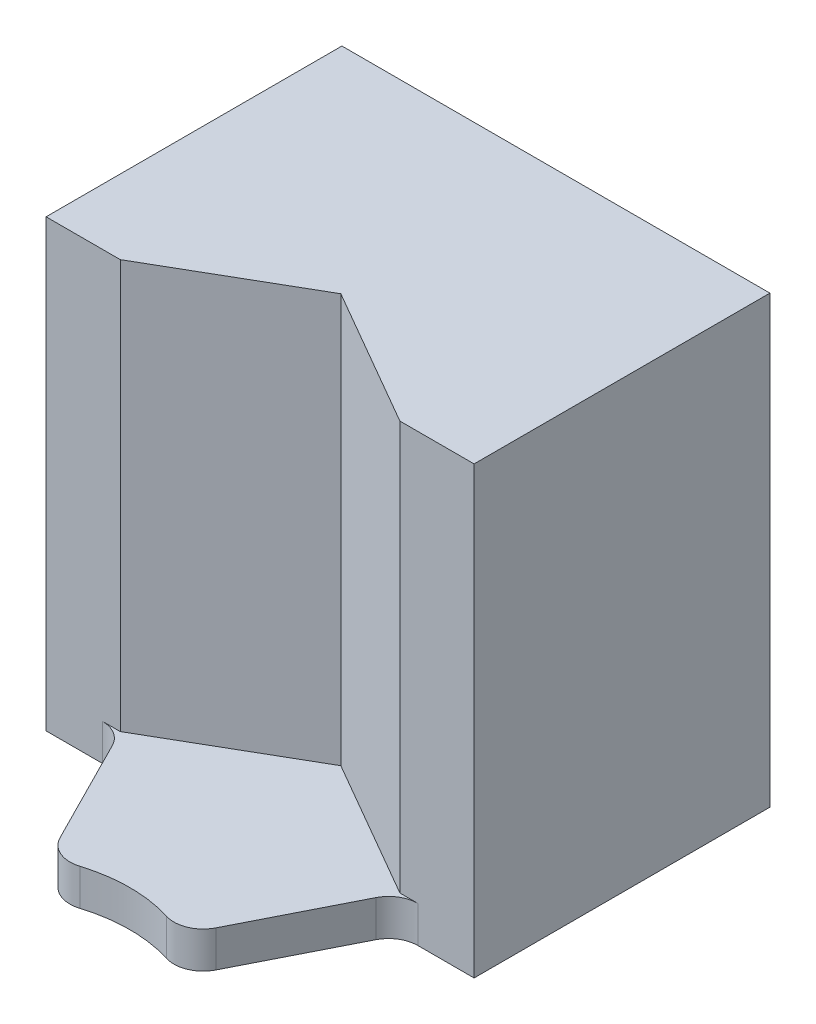
ISO-10303-21;
HEADER;
FILE_DESCRIPTION(('STEP AP214'),'2;1');
FILE_NAME('part.step','',(''),(''),'','','');
FILE_SCHEMA(('AUTOMOTIVE_DESIGN { 1 0 10303 214 1 1 1 1 }'));
ENDSEC;
DATA;
#1=APPLICATION_CONTEXT('core data for automotive mechanical design processes');
#2=APPLICATION_PROTOCOL_DEFINITION('international standard','automotive_design',2000,#1);
#3=PRODUCT_CONTEXT('',#1,'mechanical');
#4=PRODUCT('Part','Part','',(#3));
#5=PRODUCT_RELATED_PRODUCT_CATEGORY('part','',(#4));
#6=PRODUCT_DEFINITION_FORMATION('','',#4);
#7=PRODUCT_DEFINITION_CONTEXT('part definition',#1,'design');
#8=PRODUCT_DEFINITION('design','',#6,#7);
#9=PRODUCT_DEFINITION_SHAPE('','',#8);
#10=(LENGTH_UNIT() NAMED_UNIT(*) SI_UNIT(.MILLI.,.METRE.));
#11=(NAMED_UNIT(*) PLANE_ANGLE_UNIT() SI_UNIT($,.RADIAN.));
#12=(NAMED_UNIT(*) SI_UNIT($,.STERADIAN.) SOLID_ANGLE_UNIT());
#13=UNCERTAINTY_MEASURE_WITH_UNIT(LENGTH_MEASURE(1.E-05),#10,'distance_accuracy_value','');
#14=(GEOMETRIC_REPRESENTATION_CONTEXT(3) GLOBAL_UNCERTAINTY_ASSIGNED_CONTEXT((#13)) GLOBAL_UNIT_ASSIGNED_CONTEXT((#10,
#11,#12)) REPRESENTATION_CONTEXT('',''));
#15=CARTESIAN_POINT('',(0.,0.,0.));
#16=DIRECTION('',(0.,0.,1.));
#17=DIRECTION('',(1.,0.,0.));
#18=AXIS2_PLACEMENT_3D('',#15,#16,#17);
#19=CARTESIAN_POINT('',(-47.8912048292795,140.,27.65));
#20=DIRECTION('',(-0.5,0.,-0.866025403784439));
#21=DIRECTION('',(-0.866025403784439,0.,0.5));
#22=AXIS2_PLACEMENT_3D('',#19,#20,#21);
#23=PLANE('',#22);
#24=DIRECTION('',(0.866025403784439,0.,-0.5));
#25=VECTOR('',#24,1.);
#26=CARTESIAN_POINT('',(-47.8912048292795,0.,27.65));
#27=LINE('',#26,#25);
#28=CARTESIAN_POINT('',(-47.8912048292796,0.,27.65));
#29=VERTEX_POINT('',#28);
#30=CARTESIAN_POINT('',(0.,0.,0.));
#31=VERTEX_POINT('',#30);
#32=EDGE_CURVE('E187',#29,#31,#27,.T.);
#33=ORIENTED_EDGE('',*,*,#32,.T.);
#34=DIRECTION('',(0.,-1.,0.));
#35=VECTOR('',#34,1.);
#36=CARTESIAN_POINT('',(0.,140.,0.));
#37=LINE('',#36,#35);
#38=CARTESIAN_POINT('',(0.,140.,0.));
#39=VERTEX_POINT('',#38);
#40=EDGE_CURVE('E224',#39,#31,#37,.T.);
#41=ORIENTED_EDGE('',*,*,#40,.F.);
#42=DIRECTION('',(0.866025403784439,0.,-0.5));
#43=VECTOR('',#42,1.);
#44=CARTESIAN_POINT('',(-47.8912048292795,140.,27.65));
#45=LINE('',#44,#43);
#46=CARTESIAN_POINT('',(-47.8912048292795,140.,27.65));
#47=VERTEX_POINT('',#46);
#48=EDGE_CURVE('E196',#47,#39,#45,.T.);
#49=ORIENTED_EDGE('',*,*,#48,.F.);
#50=DIRECTION('',(0.,-1.,0.));
#51=VECTOR('',#50,1.);
#52=CARTESIAN_POINT('',(-47.8912048292795,140.,27.65));
#53=LINE('',#52,#51);
#54=EDGE_CURVE('E166',#47,#29,#53,.T.);
#55=ORIENTED_EDGE('',*,*,#54,.T.);
#56=EDGE_LOOP('',(#33,#41,#49,#55));
#57=FACE_BOUND('',#56,.T.);
#58=ADVANCED_FACE('F37',(#57),#23,.F.);
#59=CARTESIAN_POINT('',(0.,140.,0.));
#60=DIRECTION('',(0.5,0.,-0.866025403784439));
#61=DIRECTION('',(-0.866025403784439,0.,-0.5));
#62=AXIS2_PLACEMENT_3D('',#59,#60,#61);
#63=PLANE('',#62);
#64=DIRECTION('',(0.866025403784439,0.,0.5));
#65=VECTOR('',#64,1.);
#66=CARTESIAN_POINT('',(0.,0.,0.));
#67=LINE('',#66,#65);
#68=CARTESIAN_POINT('',(47.8912048292795,0.,27.65));
#69=VERTEX_POINT('',#68);
#70=EDGE_CURVE('E200',#31,#69,#67,.T.);
#71=ORIENTED_EDGE('',*,*,#70,.T.);
#72=DIRECTION('',(0.,-1.,0.));
#73=VECTOR('',#72,1.);
#74=CARTESIAN_POINT('',(47.8912048292795,140.,27.65));
#75=LINE('',#74,#73);
#76=CARTESIAN_POINT('',(47.8912048292795,140.,27.65));
#77=VERTEX_POINT('',#76);
#78=EDGE_CURVE('E222',#77,#69,#75,.T.);
#79=ORIENTED_EDGE('',*,*,#78,.F.);
#80=DIRECTION('',(0.866025403784439,0.,0.5));
#81=VECTOR('',#80,1.);
#82=CARTESIAN_POINT('',(0.,140.,0.));
#83=LINE('',#82,#81);
#84=EDGE_CURVE('E199',#39,#77,#83,.T.);
#85=ORIENTED_EDGE('',*,*,#84,.F.);
#86=ORIENTED_EDGE('',*,*,#40,.T.);
#87=EDGE_LOOP('',(#71,#79,#85,#86));
#88=FACE_BOUND('',#87,.T.);
#89=ADVANCED_FACE('F315',(#88),#63,.F.);
#90=CARTESIAN_POINT('',(47.8912048292795,140.,27.65));
#91=DIRECTION('',(0.,0.,-1.));
#92=DIRECTION('',(-1.,0.,0.));
#93=AXIS2_PLACEMENT_3D('',#90,#91,#92);
#94=PLANE('',#93);
#95=ORIENTED_EDGE('',*,*,#78,.T.);
#96=DIRECTION('',(1.,0.,0.));
#97=VECTOR('',#96,1.);
#98=CARTESIAN_POINT('',(-1.67084580901511E-13,0.,27.6499999999999));
#99=LINE('',#98,#97);
#100=CARTESIAN_POINT('',(54.037439141378,0.,27.65));
#101=VERTEX_POINT('',#100);
#102=EDGE_CURVE('E52',#69,#101,#99,.T.);
#103=ORIENTED_EDGE('',*,*,#102,.T.);
#104=DIRECTION('',(0.,1.,0.));
#105=VECTOR('',#104,1.);
#106=CARTESIAN_POINT('',(54.037439141378,-12.5,27.65));
#107=LINE('',#106,#105);
#108=CARTESIAN_POINT('',(54.037439141378,-12.5,27.6500000000002));
#109=VERTEX_POINT('',#108);
#110=EDGE_CURVE('E232',#101,#109,#107,.F.);
#111=ORIENTED_EDGE('',*,*,#110,.T.);
#112=DIRECTION('',(-1.,0.,0.));
#113=VECTOR('',#112,1.);
#114=CARTESIAN_POINT('',(73.3,-12.5,27.65));
#115=LINE('',#114,#113);
#116=CARTESIAN_POINT('',(73.3,-12.5,27.65));
#117=VERTEX_POINT('',#116);
#118=EDGE_CURVE('E177',#117,#109,#115,.T.);
#119=ORIENTED_EDGE('',*,*,#118,.F.);
#120=DIRECTION('',(0.,-1.,0.));
#121=VECTOR('',#120,1.);
#122=CARTESIAN_POINT('',(73.3,140.,27.65));
#123=LINE('',#122,#121);
#124=CARTESIAN_POINT('',(73.3,140.,27.65));
#125=VERTEX_POINT('',#124);
#126=EDGE_CURVE('E220',#125,#117,#123,.T.);
#127=ORIENTED_EDGE('',*,*,#126,.F.);
#128=DIRECTION('',(1.,0.,0.));
#129=VECTOR('',#128,1.);
#130=CARTESIAN_POINT('',(47.8912048292795,140.,27.65));
#131=LINE('',#130,#129);
#132=EDGE_CURVE('E202',#77,#125,#131,.T.);
#133=ORIENTED_EDGE('',*,*,#132,.F.);
#134=EDGE_LOOP('',(#95,#103,#111,#119,#127,#133));
#135=FACE_BOUND('',#134,.T.);
#136=ADVANCED_FACE('F286',(#135),#94,.F.);
#137=CARTESIAN_POINT('',(73.3,140.,27.65));
#138=DIRECTION('',(-1.,0.,0.));
#139=DIRECTION('',(0.,0.,1.));
#140=AXIS2_PLACEMENT_3D('',#137,#138,#139);
#141=PLANE('',#140);
#142=ORIENTED_EDGE('',*,*,#126,.T.);
#143=DIRECTION('',(0.,0.,1.));
#144=VECTOR('',#143,1.);
#145=CARTESIAN_POINT('',(73.3,-12.5,-73.6728606432883));
#146=LINE('',#145,#144);
#147=CARTESIAN_POINT('',(73.3,-12.5,-73.6728606432883));
#148=VERTEX_POINT('',#147);
#149=EDGE_CURVE('E172',#148,#117,#146,.T.);
#150=ORIENTED_EDGE('',*,*,#149,.F.);
#151=DIRECTION('',(0.,-1.,0.));
#152=VECTOR('',#151,1.);
#153=CARTESIAN_POINT('',(73.3,140.,-73.6728606432883));
#154=LINE('',#153,#152);
#155=CARTESIAN_POINT('',(73.3,140.,-73.6728606432883));
#156=VERTEX_POINT('',#155);
#157=EDGE_CURVE('E218',#156,#148,#154,.T.);
#158=ORIENTED_EDGE('',*,*,#157,.F.);
#159=DIRECTION('',(0.,0.,-1.));
#160=VECTOR('',#159,1.);
#161=CARTESIAN_POINT('',(73.3,140.,27.65));
#162=LINE('',#161,#160);
#163=EDGE_CURVE('E204',#125,#156,#162,.T.);
#164=ORIENTED_EDGE('',*,*,#163,.F.);
#165=EDGE_LOOP('',(#142,#150,#158,#164));
#166=FACE_BOUND('',#165,.T.);
#167=ADVANCED_FACE('F282',(#166),#141,.F.);
#168=CARTESIAN_POINT('',(73.3,140.,-73.6728606432883));
#169=DIRECTION('',(0.,0.,1.));
#170=DIRECTION('',(1.,0.,0.));
#171=AXIS2_PLACEMENT_3D('',#168,#169,#170);
#172=PLANE('',#171);
#173=ORIENTED_EDGE('',*,*,#157,.T.);
#174=DIRECTION('',(1.,0.,0.));
#175=VECTOR('',#174,1.);
#176=CARTESIAN_POINT('',(-73.3,-12.5,-73.6728606432883));
#177=LINE('',#176,#175);
#178=CARTESIAN_POINT('',(-73.3,-12.5,-73.6728606432883));
#179=VERTEX_POINT('',#178);
#180=EDGE_CURVE('E170',#179,#148,#177,.T.);
#181=ORIENTED_EDGE('',*,*,#180,.F.);
#182=DIRECTION('',(0.,-1.,0.));
#183=VECTOR('',#182,1.);
#184=CARTESIAN_POINT('',(-73.3,140.,-73.6728606432883));
#185=LINE('',#184,#183);
#186=CARTESIAN_POINT('',(-73.3,140.,-73.6728606432883));
#187=VERTEX_POINT('',#186);
#188=EDGE_CURVE('E165',#187,#179,#185,.T.);
#189=ORIENTED_EDGE('',*,*,#188,.F.);
#190=DIRECTION('',(-1.,0.,0.));
#191=VECTOR('',#190,1.);
#192=CARTESIAN_POINT('',(73.3,140.,-73.6728606432883));
#193=LINE('',#192,#191);
#194=EDGE_CURVE('E206',#156,#187,#193,.T.);
#195=ORIENTED_EDGE('',*,*,#194,.F.);
#196=EDGE_LOOP('',(#173,#181,#189,#195));
#197=FACE_BOUND('',#196,.T.);
#198=ADVANCED_FACE('F278',(#197),#172,.F.);
#199=CARTESIAN_POINT('',(-73.3,140.,-73.6728606432883));
#200=DIRECTION('',(1.,0.,0.));
#201=DIRECTION('',(0.,0.,-1.));
#202=AXIS2_PLACEMENT_3D('',#199,#200,#201);
#203=PLANE('',#202);
#204=ORIENTED_EDGE('',*,*,#188,.T.);
#205=DIRECTION('',(0.,0.,-1.));
#206=VECTOR('',#205,1.);
#207=CARTESIAN_POINT('',(-73.3,-12.5,27.65));
#208=LINE('',#207,#206);
#209=CARTESIAN_POINT('',(-73.3,-12.5,27.65));
#210=VERTEX_POINT('',#209);
#211=EDGE_CURVE('E149',#210,#179,#208,.T.);
#212=ORIENTED_EDGE('',*,*,#211,.F.);
#213=DIRECTION('',(0.,-1.,0.));
#214=VECTOR('',#213,1.);
#215=CARTESIAN_POINT('',(-73.3,140.,27.65));
#216=LINE('',#215,#214);
#217=CARTESIAN_POINT('',(-73.3,140.,27.65));
#218=VERTEX_POINT('',#217);
#219=EDGE_CURVE('E159',#218,#210,#216,.T.);
#220=ORIENTED_EDGE('',*,*,#219,.F.);
#221=DIRECTION('',(0.,0.,1.));
#222=VECTOR('',#221,1.);
#223=CARTESIAN_POINT('',(-73.3,140.,-73.6728606432883));
#224=LINE('',#223,#222);
#225=EDGE_CURVE('E208',#187,#218,#224,.T.);
#226=ORIENTED_EDGE('',*,*,#225,.F.);
#227=EDGE_LOOP('',(#204,#212,#220,#226));
#228=FACE_BOUND('',#227,.T.);
#229=ADVANCED_FACE('F168',(#228),#203,.F.);
#230=CARTESIAN_POINT('',(-73.3,140.,27.65));
#231=DIRECTION('',(0.,0.,-1.));
#232=DIRECTION('',(-1.,0.,0.));
#233=AXIS2_PLACEMENT_3D('',#230,#231,#232);
#234=PLANE('',#233);
#235=DIRECTION('',(-1.,0.,0.));
#236=VECTOR('',#235,1.);
#237=CARTESIAN_POINT('',(-47.8912048292796,-12.5,27.65));
#238=LINE('',#237,#236);
#239=CARTESIAN_POINT('',(-54.037439141378,-12.5,27.65));
#240=VERTEX_POINT('',#239);
#241=EDGE_CURVE('E143',#240,#210,#238,.T.);
#242=ORIENTED_EDGE('',*,*,#241,.F.);
#243=DIRECTION('',(0.,1.,0.));
#244=VECTOR('',#243,1.);
#245=CARTESIAN_POINT('',(-54.037439141378,0.,27.65));
#246=LINE('',#245,#244);
#247=CARTESIAN_POINT('',(-54.037439141378,0.,27.65));
#248=VERTEX_POINT('',#247);
#249=EDGE_CURVE('E255',#240,#248,#246,.T.);
#250=ORIENTED_EDGE('',*,*,#249,.T.);
#251=DIRECTION('',(1.,0.,0.));
#252=VECTOR('',#251,1.);
#253=CARTESIAN_POINT('',(-3.09188867788745E-13,0.,27.65));
#254=LINE('',#253,#252);
#255=EDGE_CURVE('E253',#248,#29,#254,.T.);
#256=ORIENTED_EDGE('',*,*,#255,.T.);
#257=ORIENTED_EDGE('',*,*,#54,.F.);
#258=DIRECTION('',(1.,0.,0.));
#259=VECTOR('',#258,1.);
#260=CARTESIAN_POINT('',(-73.3,140.,27.65));
#261=LINE('',#260,#259);
#262=EDGE_CURVE('E162',#218,#47,#261,.T.);
#263=ORIENTED_EDGE('',*,*,#262,.F.);
#264=ORIENTED_EDGE('',*,*,#219,.T.);
#265=EDGE_LOOP('',(#242,#250,#256,#257,#263,#264));
#266=FACE_BOUND('',#265,.T.);
#267=ADVANCED_FACE('F160',(#266),#234,.F.);
#268=CARTESIAN_POINT('',(0.,140.,0.));
#269=DIRECTION('',(0.,-1.,0.));
#270=DIRECTION('',(0.,0.,-1.));
#271=AXIS2_PLACEMENT_3D('',#268,#269,#270);
#272=PLANE('',#271);
#273=ORIENTED_EDGE('',*,*,#48,.T.);
#274=ORIENTED_EDGE('',*,*,#84,.T.);
#275=ORIENTED_EDGE('',*,*,#132,.T.);
#276=ORIENTED_EDGE('',*,*,#163,.T.);
#277=ORIENTED_EDGE('',*,*,#194,.T.);
#278=ORIENTED_EDGE('',*,*,#225,.T.);
#279=ORIENTED_EDGE('',*,*,#262,.T.);
#280=EDGE_LOOP('',(#273,#274,#275,#276,#277,#278,#279));
#281=FACE_BOUND('',#280,.T.);
#282=ADVANCED_FACE('F272',(#281),#272,.F.);
#283=CARTESIAN_POINT('',(22.5814783280047,-12.5,77.65));
#284=DIRECTION('',(-0.892205545044823,0.,-0.451629566560107));
#285=DIRECTION('',(-0.451629566560107,0.,0.892205545044823));
#286=AXIS2_PLACEMENT_3D('',#283,#284,#285);
#287=PLANE('',#286);
#288=DIRECTION('',(-0.451629566560107,0.,0.892205545044823));
#289=VECTOR('',#288,1.);
#290=CARTESIAN_POINT('',(22.5814783280047,-12.5,77.65));
#291=LINE('',#290,#289);
#292=CARTESIAN_POINT('',(45.1153836909297,-12.5,33.1337043343989));
#293=VERTEX_POINT('',#292);
#294=CARTESIAN_POINT('',(26.7187654817622,-12.5,69.4766853781507));
#295=VERTEX_POINT('',#294);
#296=EDGE_CURVE('E180',#293,#295,#291,.T.);
#297=ORIENTED_EDGE('',*,*,#296,.F.);
#298=DIRECTION('',(0.,1.,0.));
#299=VECTOR('',#298,1.);
#300=CARTESIAN_POINT('',(45.1153836909297,0.,33.1337043343989));
#301=LINE('',#300,#299);
#302=CARTESIAN_POINT('',(45.1153836909297,0.,33.1337043343989));
#303=VERTEX_POINT('',#302);
#304=EDGE_CURVE('E229',#293,#303,#301,.T.);
#305=ORIENTED_EDGE('',*,*,#304,.T.);
#306=DIRECTION('',(-0.451629566560107,0.,0.892205545044823));
#307=VECTOR('',#306,1.);
#308=CARTESIAN_POINT('',(22.5814783280047,0.,77.65));
#309=LINE('',#308,#307);
#310=CARTESIAN_POINT('',(26.7187654817622,0.,69.4766853781507));
#311=VERTEX_POINT('',#310);
#312=EDGE_CURVE('E188',#303,#311,#309,.T.);
#313=ORIENTED_EDGE('',*,*,#312,.T.);
#314=DIRECTION('',(0.,1.,0.));
#315=VECTOR('',#314,1.);
#316=CARTESIAN_POINT('',(26.7187654817622,-12.5,69.4766853781507));
#317=LINE('',#316,#315);
#318=EDGE_CURVE('E227',#311,#295,#317,.F.);
#319=ORIENTED_EDGE('',*,*,#318,.T.);
#320=EDGE_LOOP('',(#297,#305,#313,#319));
#321=FACE_BOUND('',#320,.T.);
#322=ADVANCED_FACE('F295',(#321),#287,.F.);
#323=CARTESIAN_POINT('',(-2.4459601011273E-13,-12.5,122.260277252241));
#324=DIRECTION('',(0.,1.,0.));
#325=DIRECTION('',(0.,0.,1.));
#326=AXIS2_PLACEMENT_3D('',#323,#324,#325);
#327=CYLINDRICAL_SURFACE('',#326,50.);
#328=CARTESIAN_POINT('',(-2.4459601011273E-13,-12.5,122.260277252241));
#329=DIRECTION('',(0.,1.,0.));
#330=DIRECTION('',(0.,0.,-1.));
#331=AXIS2_PLACEMENT_3D('',#328,#329,#330);
#332=CIRCLE('',#331,50.);
#333=CARTESIAN_POINT('',(14.8305916927616,-12.5,74.5103709691649));
#334=VERTEX_POINT('',#333);
#335=CARTESIAN_POINT('',(-14.8305916927621,-12.5,74.5103709691649));
#336=VERTEX_POINT('',#335);
#337=EDGE_CURVE('E182',#334,#336,#332,.T.);
#338=ORIENTED_EDGE('',*,*,#337,.F.);
#339=DIRECTION('',(0.,1.,0.));
#340=VECTOR('',#339,1.);
#341=CARTESIAN_POINT('',(14.8305916927616,-12.5,74.5103709691649));
#342=LINE('',#341,#340);
#343=CARTESIAN_POINT('',(14.8305916927616,0.,74.5103709691649));
#344=VERTEX_POINT('',#343);
#345=EDGE_CURVE('E237',#334,#344,#342,.T.);
#346=ORIENTED_EDGE('',*,*,#345,.T.);
#347=CARTESIAN_POINT('',(-2.4459601011273E-13,0.,122.260277252241));
#348=DIRECTION('',(0.,1.,0.));
#349=DIRECTION('',(0.,0.,-1.));
#350=AXIS2_PLACEMENT_3D('',#347,#348,#349);
#351=CIRCLE('',#350,50.);
#352=CARTESIAN_POINT('',(-14.8305916927621,0.,74.5103709691649));
#353=VERTEX_POINT('',#352);
#354=EDGE_CURVE('E191',#344,#353,#351,.T.);
#355=ORIENTED_EDGE('',*,*,#354,.T.);
#356=DIRECTION('',(0.,1.,0.));
#357=VECTOR('',#356,1.);
#358=CARTESIAN_POINT('',(-14.8305916927621,-12.5,74.5103709691649));
#359=LINE('',#358,#357);
#360=EDGE_CURVE('E235',#353,#336,#359,.F.);
#361=ORIENTED_EDGE('',*,*,#360,.T.);
#362=EDGE_LOOP('',(#338,#346,#355,#361));
#363=FACE_BOUND('',#362,.T.);
#364=ADVANCED_FACE('F303',(#363),#327,.F.);
#365=CARTESIAN_POINT('',(-47.8912048292796,-12.5,27.65));
#366=DIRECTION('',(0.892205545044826,0.,-0.4516295665601));
#367=DIRECTION('',(-0.4516295665601,0.,-0.892205545044827));
#368=AXIS2_PLACEMENT_3D('',#365,#366,#367);
#369=PLANE('',#368);
#370=DIRECTION('',(-0.4516295665601,0.,-0.892205545044826));
#371=VECTOR('',#370,1.);
#372=CARTESIAN_POINT('',(-47.8912048292796,-12.5,27.65));
#373=LINE('',#372,#371);
#374=CARTESIAN_POINT('',(-26.7187654817627,-12.5,69.4766853781506));
#375=VERTEX_POINT('',#374);
#376=CARTESIAN_POINT('',(-45.1153836909298,-12.5,33.133704334399));
#377=VERTEX_POINT('',#376);
#378=EDGE_CURVE('E185',#375,#377,#373,.T.);
#379=ORIENTED_EDGE('',*,*,#378,.F.);
#380=DIRECTION('',(0.,1.,0.));
#381=VECTOR('',#380,1.);
#382=CARTESIAN_POINT('',(-26.7187654817627,-12.5,69.4766853781506));
#383=LINE('',#382,#381);
#384=CARTESIAN_POINT('',(-26.7187654817627,0.,69.4766853781506));
#385=VERTEX_POINT('',#384);
#386=EDGE_CURVE('E250',#375,#385,#383,.T.);
#387=ORIENTED_EDGE('',*,*,#386,.T.);
#388=DIRECTION('',(-0.4516295665601,0.,-0.892205545044826));
#389=VECTOR('',#388,1.);
#390=CARTESIAN_POINT('',(-47.8912048292796,0.,27.65));
#391=LINE('',#390,#389);
#392=CARTESIAN_POINT('',(-45.1153836909298,0.,33.133704334399));
#393=VERTEX_POINT('',#392);
#394=EDGE_CURVE('E155',#385,#393,#391,.T.);
#395=ORIENTED_EDGE('',*,*,#394,.T.);
#396=DIRECTION('',(0.,1.,0.));
#397=VECTOR('',#396,1.);
#398=CARTESIAN_POINT('',(-45.1153836909298,-12.5,33.133704334399));
#399=LINE('',#398,#397);
#400=EDGE_CURVE('E248',#393,#377,#399,.F.);
#401=ORIENTED_EDGE('',*,*,#400,.T.);
#402=EDGE_LOOP('',(#379,#387,#395,#401));
#403=FACE_BOUND('',#402,.T.);
#404=ADVANCED_FACE('F266',(#403),#369,.F.);
#405=CARTESIAN_POINT('',(-2.4459601011273E-13,-12.5,122.260277252241));
#406=DIRECTION('',(0.,-1.,0.));
#407=DIRECTION('',(0.,0.,-1.));
#408=AXIS2_PLACEMENT_3D('',#405,#406,#407);
#409=PLANE('',#408);
#410=ORIENTED_EDGE('',*,*,#296,.T.);
#411=CARTESIAN_POINT('',(17.796710031314,-12.5,64.9603897125496));
#412=DIRECTION('',(0.,-1.,0.));
#413=DIRECTION('',(0.,0.,-1.));
#414=AXIS2_PLACEMENT_3D('',#411,#412,#413);
#415=CIRCLE('',#414,10.);
#416=EDGE_CURVE('E246',#295,#334,#415,.T.);
#417=ORIENTED_EDGE('',*,*,#416,.T.);
#418=ORIENTED_EDGE('',*,*,#337,.T.);
#419=CARTESIAN_POINT('',(-17.7967100313144,-12.5,64.9603897125496));
#420=DIRECTION('',(0.,-1.,0.));
#421=DIRECTION('',(0.,0.,-1.));
#422=AXIS2_PLACEMENT_3D('',#419,#420,#421);
#423=CIRCLE('',#422,10.);
#424=EDGE_CURVE('E244',#336,#375,#423,.T.);
#425=ORIENTED_EDGE('',*,*,#424,.T.);
#426=ORIENTED_EDGE('',*,*,#378,.T.);
#427=CARTESIAN_POINT('',(-54.037439141378,-12.5,37.65));
#428=DIRECTION('',(0.,-1.,0.));
#429=DIRECTION('',(0.,0.,-1.));
#430=AXIS2_PLACEMENT_3D('',#427,#428,#429);
#431=CIRCLE('',#430,10.);
#432=EDGE_CURVE('E11',#377,#240,#431,.F.);
#433=ORIENTED_EDGE('',*,*,#432,.T.);
#434=ORIENTED_EDGE('',*,*,#241,.T.);
#435=ORIENTED_EDGE('',*,*,#211,.T.);
#436=ORIENTED_EDGE('',*,*,#180,.T.);
#437=ORIENTED_EDGE('',*,*,#149,.T.);
#438=ORIENTED_EDGE('',*,*,#118,.T.);
#439=CARTESIAN_POINT('',(54.037439141378,-12.5,37.65));
#440=DIRECTION('',(0.,-1.,0.));
#441=DIRECTION('',(0.,0.,-1.));
#442=AXIS2_PLACEMENT_3D('',#439,#440,#441);
#443=CIRCLE('',#442,10.);
#444=EDGE_CURVE('E259',#109,#293,#443,.F.);
#445=ORIENTED_EDGE('',*,*,#444,.T.);
#446=EDGE_LOOP('',(#410,#417,#418,#425,#426,#433,#434,#435,#436,#437,#438,#445));
#447=FACE_BOUND('',#446,.T.);
#448=ADVANCED_FACE('F146',(#447),#409,.T.);
#449=CARTESIAN_POINT('',(-2.4459601011273E-13,0.,122.260277252241));
#450=DIRECTION('',(0.,-1.,0.));
#451=DIRECTION('',(0.,0.,-1.));
#452=AXIS2_PLACEMENT_3D('',#449,#450,#451);
#453=PLANE('',#452);
#454=ORIENTED_EDGE('',*,*,#354,.F.);
#455=CARTESIAN_POINT('',(17.796710031314,0.,64.9603897125496));
#456=DIRECTION('',(0.,-1.,0.));
#457=DIRECTION('',(0.,0.,-1.));
#458=AXIS2_PLACEMENT_3D('',#455,#456,#457);
#459=CIRCLE('',#458,10.);
#460=EDGE_CURVE('E242',#344,#311,#459,.F.);
#461=ORIENTED_EDGE('',*,*,#460,.T.);
#462=ORIENTED_EDGE('',*,*,#312,.F.);
#463=CARTESIAN_POINT('',(54.037439141378,0.,37.65));
#464=DIRECTION('',(0.,-1.,0.));
#465=DIRECTION('',(0.,0.,-1.));
#466=AXIS2_PLACEMENT_3D('',#463,#464,#465);
#467=CIRCLE('',#466,10.);
#468=EDGE_CURVE('E257',#303,#101,#467,.T.);
#469=ORIENTED_EDGE('',*,*,#468,.T.);
#470=ORIENTED_EDGE('',*,*,#102,.F.);
#471=ORIENTED_EDGE('',*,*,#70,.F.);
#472=ORIENTED_EDGE('',*,*,#32,.F.);
#473=ORIENTED_EDGE('',*,*,#255,.F.);
#474=CARTESIAN_POINT('',(-54.037439141378,0.,37.65));
#475=DIRECTION('',(0.,-1.,0.));
#476=DIRECTION('',(0.,0.,-1.));
#477=AXIS2_PLACEMENT_3D('',#474,#475,#476);
#478=CIRCLE('',#477,10.);
#479=EDGE_CURVE('E45',#248,#393,#478,.T.);
#480=ORIENTED_EDGE('',*,*,#479,.T.);
#481=ORIENTED_EDGE('',*,*,#394,.F.);
#482=CARTESIAN_POINT('',(-17.7967100313144,0.,64.9603897125496));
#483=DIRECTION('',(0.,-1.,0.));
#484=DIRECTION('',(0.,0.,-1.));
#485=AXIS2_PLACEMENT_3D('',#482,#483,#484);
#486=CIRCLE('',#485,10.);
#487=EDGE_CURVE('E240',#385,#353,#486,.F.);
#488=ORIENTED_EDGE('',*,*,#487,.T.);
#489=EDGE_LOOP('',(#454,#461,#462,#469,#470,#471,#472,#473,#480,#481,#488));
#490=FACE_BOUND('',#489,.T.);
#491=ADVANCED_FACE('F262',(#490),#453,.F.);
#492=CARTESIAN_POINT('',(54.037439141378,-12.5,37.65));
#493=DIRECTION('',(0.,-1.,0.));
#494=DIRECTION('',(0.,0.,-1.));
#495=AXIS2_PLACEMENT_3D('',#492,#493,#494);
#496=CYLINDRICAL_SURFACE('',#495,10.);
#497=ORIENTED_EDGE('',*,*,#444,.F.);
#498=ORIENTED_EDGE('',*,*,#110,.F.);
#499=ORIENTED_EDGE('',*,*,#468,.F.);
#500=ORIENTED_EDGE('',*,*,#304,.F.);
#501=EDGE_LOOP('',(#497,#498,#499,#500));
#502=FACE_BOUND('',#501,.T.);
#503=ADVANCED_FACE('F292',(#502),#496,.F.);
#504=CARTESIAN_POINT('',(17.796710031314,-12.5,64.9603897125496));
#505=DIRECTION('',(0.,1.,0.));
#506=DIRECTION('',(0.,0.,1.));
#507=AXIS2_PLACEMENT_3D('',#504,#505,#506);
#508=CYLINDRICAL_SURFACE('',#507,10.);
#509=ORIENTED_EDGE('',*,*,#416,.F.);
#510=ORIENTED_EDGE('',*,*,#318,.F.);
#511=ORIENTED_EDGE('',*,*,#460,.F.);
#512=ORIENTED_EDGE('',*,*,#345,.F.);
#513=EDGE_LOOP('',(#509,#510,#511,#512));
#514=FACE_BOUND('',#513,.T.);
#515=ADVANCED_FACE('F300',(#514),#508,.T.);
#516=CARTESIAN_POINT('',(-17.7967100313144,-12.5,64.9603897125496));
#517=DIRECTION('',(0.,1.,0.));
#518=DIRECTION('',(0.,0.,1.));
#519=AXIS2_PLACEMENT_3D('',#516,#517,#518);
#520=CYLINDRICAL_SURFACE('',#519,10.);
#521=ORIENTED_EDGE('',*,*,#424,.F.);
#522=ORIENTED_EDGE('',*,*,#360,.F.);
#523=ORIENTED_EDGE('',*,*,#487,.F.);
#524=ORIENTED_EDGE('',*,*,#386,.F.);
#525=EDGE_LOOP('',(#521,#522,#523,#524));
#526=FACE_BOUND('',#525,.T.);
#527=ADVANCED_FACE('F307',(#526),#520,.T.);
#528=CARTESIAN_POINT('',(-54.037439141378,140.,37.65));
#529=DIRECTION('',(0.,-1.,0.));
#530=DIRECTION('',(0.,0.,-1.));
#531=AXIS2_PLACEMENT_3D('',#528,#529,#530);
#532=CYLINDRICAL_SURFACE('',#531,10.);
#533=ORIENTED_EDGE('',*,*,#432,.F.);
#534=ORIENTED_EDGE('',*,*,#400,.F.);
#535=ORIENTED_EDGE('',*,*,#479,.F.);
#536=ORIENTED_EDGE('',*,*,#249,.F.);
#537=EDGE_LOOP('',(#533,#534,#535,#536));
#538=FACE_BOUND('',#537,.T.);
#539=ADVANCED_FACE('F39',(#538),#532,.F.);
#540=CLOSED_SHELL('',(#58,#89,#136,#167,#198,#229,#267,#282,#322,#364,#404,#448,#491,#503,#515,
#527,#539));
#541=MANIFOLD_SOLID_BREP('B2',#540);
#542=ADVANCED_BREP_SHAPE_REPRESENTATION('',(#18,#541),#14);
#543=SHAPE_DEFINITION_REPRESENTATION(#9,#542);
ENDSEC;
END-ISO-10303-21;
